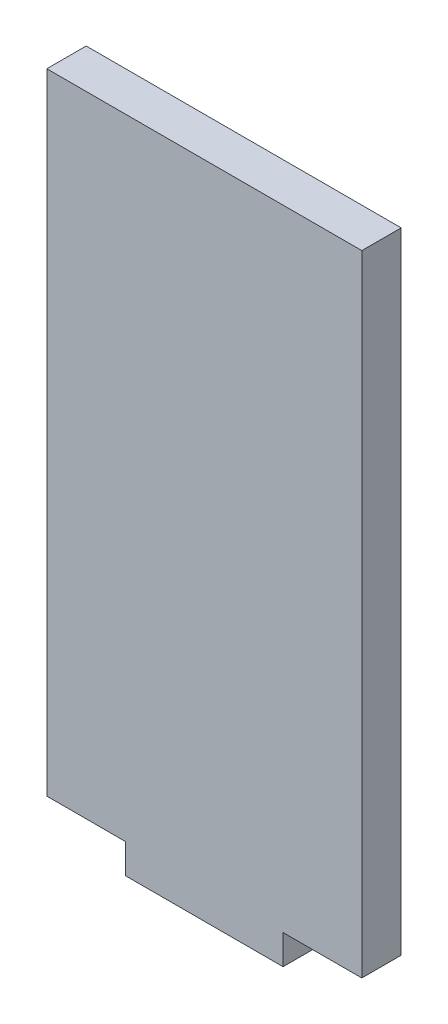
ISO-10303-21;
HEADER;
FILE_DESCRIPTION(('STEP AP214'),'2;1');
FILE_NAME('part.step','',(''),(''),'','','');
FILE_SCHEMA(('AUTOMOTIVE_DESIGN { 1 0 10303 214 1 1 1 1 }'));
ENDSEC;
DATA;
#1=APPLICATION_CONTEXT('core data for automotive mechanical design processes');
#2=APPLICATION_PROTOCOL_DEFINITION('international standard','automotive_design',2000,#1);
#3=PRODUCT_CONTEXT('',#1,'mechanical');
#4=PRODUCT('Part','Part','',(#3));
#5=PRODUCT_RELATED_PRODUCT_CATEGORY('part','',(#4));
#6=PRODUCT_DEFINITION_FORMATION('','',#4);
#7=PRODUCT_DEFINITION_CONTEXT('part definition',#1,'design');
#8=PRODUCT_DEFINITION('design','',#6,#7);
#9=PRODUCT_DEFINITION_SHAPE('','',#8);
#10=(LENGTH_UNIT() NAMED_UNIT(*) SI_UNIT(.MILLI.,.METRE.));
#11=(NAMED_UNIT(*) PLANE_ANGLE_UNIT() SI_UNIT($,.RADIAN.));
#12=(NAMED_UNIT(*) SI_UNIT($,.STERADIAN.) SOLID_ANGLE_UNIT());
#13=UNCERTAINTY_MEASURE_WITH_UNIT(LENGTH_MEASURE(1.E-05),#10,'distance_accuracy_value','');
#14=(GEOMETRIC_REPRESENTATION_CONTEXT(3) GLOBAL_UNCERTAINTY_ASSIGNED_CONTEXT((#13)) GLOBAL_UNIT_ASSIGNED_CONTEXT((#10,
#11,#12)) REPRESENTATION_CONTEXT('',''));
#15=CARTESIAN_POINT('',(0.,0.,0.));
#16=DIRECTION('',(0.,0.,1.));
#17=DIRECTION('',(1.,0.,0.));
#18=AXIS2_PLACEMENT_3D('',#15,#16,#17);
#19=CARTESIAN_POINT('',(0.,0.,3.175));
#20=DIRECTION('',(1.,0.,0.));
#21=DIRECTION('',(0.,1.,0.));
#22=AXIS2_PLACEMENT_3D('',#19,#20,#21);
#23=PLANE('',#22);
#24=DIRECTION('',(0.,-1.,0.));
#25=VECTOR('',#24,1.);
#26=CARTESIAN_POINT('',(0.,0.,0.));
#27=LINE('',#26,#25);
#28=CARTESIAN_POINT('',(0.,50.8,0.));
#29=VERTEX_POINT('',#28);
#30=CARTESIAN_POINT('',(0.,0.,0.));
#31=VERTEX_POINT('',#30);
#32=EDGE_CURVE('E129',#29,#31,#27,.T.);
#33=ORIENTED_EDGE('',*,*,#32,.T.);
#34=DIRECTION('',(0.,0.,-1.));
#35=VECTOR('',#34,1.);
#36=CARTESIAN_POINT('',(0.,0.,3.175));
#37=LINE('',#36,#35);
#38=CARTESIAN_POINT('',(0.,0.,3.175));
#39=VERTEX_POINT('',#38);
#40=EDGE_CURVE('E11',#39,#31,#37,.T.);
#41=ORIENTED_EDGE('',*,*,#40,.F.);
#42=DIRECTION('',(0.,-1.,0.));
#43=VECTOR('',#42,1.);
#44=CARTESIAN_POINT('',(0.,0.,3.175));
#45=LINE('',#44,#43);
#46=CARTESIAN_POINT('',(0.,50.8,3.175));
#47=VERTEX_POINT('',#46);
#48=EDGE_CURVE('E143',#47,#39,#45,.T.);
#49=ORIENTED_EDGE('',*,*,#48,.F.);
#50=DIRECTION('',(0.,0.,-1.));
#51=VECTOR('',#50,1.);
#52=CARTESIAN_POINT('',(0.,50.8,3.175));
#53=LINE('',#52,#51);
#54=EDGE_CURVE('E125',#47,#29,#53,.T.);
#55=ORIENTED_EDGE('',*,*,#54,.T.);
#56=EDGE_LOOP('',(#33,#41,#49,#55));
#57=FACE_BOUND('',#56,.T.);
#58=ADVANCED_FACE('F33',(#57),#23,.F.);
#59=CARTESIAN_POINT('',(0.,0.,3.175));
#60=DIRECTION('',(0.,1.,0.));
#61=DIRECTION('',(0.,0.,1.));
#62=AXIS2_PLACEMENT_3D('',#59,#60,#61);
#63=PLANE('',#62);
#64=DIRECTION('',(1.,0.,0.));
#65=VECTOR('',#64,1.);
#66=CARTESIAN_POINT('',(0.,0.,0.));
#67=LINE('',#66,#65);
#68=CARTESIAN_POINT('',(6.35,0.,0.));
#69=VERTEX_POINT('',#68);
#70=EDGE_CURVE('E132',#31,#69,#67,.T.);
#71=ORIENTED_EDGE('',*,*,#70,.T.);
#72=DIRECTION('',(0.,0.,-1.));
#73=VECTOR('',#72,1.);
#74=CARTESIAN_POINT('',(6.35,0.,3.175));
#75=LINE('',#74,#73);
#76=CARTESIAN_POINT('',(6.35,0.,3.175));
#77=VERTEX_POINT('',#76);
#78=EDGE_CURVE('E41',#77,#69,#75,.T.);
#79=ORIENTED_EDGE('',*,*,#78,.F.);
#80=DIRECTION('',(1.,0.,0.));
#81=VECTOR('',#80,1.);
#82=CARTESIAN_POINT('',(0.,0.,3.175));
#83=LINE('',#82,#81);
#84=EDGE_CURVE('E92',#39,#77,#83,.T.);
#85=ORIENTED_EDGE('',*,*,#84,.F.);
#86=ORIENTED_EDGE('',*,*,#40,.T.);
#87=EDGE_LOOP('',(#71,#79,#85,#86));
#88=FACE_BOUND('',#87,.T.);
#89=ADVANCED_FACE('F178',(#88),#63,.F.);
#90=CARTESIAN_POINT('',(6.35,0.,3.175));
#91=DIRECTION('',(1.,0.,0.));
#92=DIRECTION('',(0.,0.,-1.));
#93=AXIS2_PLACEMENT_3D('',#90,#91,#92);
#94=PLANE('',#93);
#95=DIRECTION('',(0.,-1.,0.));
#96=VECTOR('',#95,1.);
#97=CARTESIAN_POINT('',(6.35,0.,0.));
#98=LINE('',#97,#96);
#99=CARTESIAN_POINT('',(6.35,-2.38793491823931,0.));
#100=VERTEX_POINT('',#99);
#101=EDGE_CURVE('E134',#69,#100,#98,.T.);
#102=ORIENTED_EDGE('',*,*,#101,.T.);
#103=DIRECTION('',(0.,0.,-1.));
#104=VECTOR('',#103,1.);
#105=CARTESIAN_POINT('',(6.35,-2.38793491823931,3.175));
#106=LINE('',#105,#104);
#107=CARTESIAN_POINT('',(6.35,-2.38793491823931,3.175));
#108=VERTEX_POINT('',#107);
#109=EDGE_CURVE('E150',#108,#100,#106,.T.);
#110=ORIENTED_EDGE('',*,*,#109,.F.);
#111=DIRECTION('',(0.,-1.,0.));
#112=VECTOR('',#111,1.);
#113=CARTESIAN_POINT('',(6.35,0.,3.175));
#114=LINE('',#113,#112);
#115=EDGE_CURVE('E158',#77,#108,#114,.T.);
#116=ORIENTED_EDGE('',*,*,#115,.F.);
#117=ORIENTED_EDGE('',*,*,#78,.T.);
#118=EDGE_LOOP('',(#102,#110,#116,#117));
#119=FACE_BOUND('',#118,.T.);
#120=ADVANCED_FACE('F156',(#119),#94,.F.);
#121=CARTESIAN_POINT('',(6.35,-2.38793491823931,3.175));
#122=DIRECTION('',(0.,1.,0.));
#123=DIRECTION('',(0.,0.,1.));
#124=AXIS2_PLACEMENT_3D('',#121,#122,#123);
#125=PLANE('',#124);
#126=DIRECTION('',(1.,0.,0.));
#127=VECTOR('',#126,1.);
#128=CARTESIAN_POINT('',(6.35,-2.38793491823931,0.));
#129=LINE('',#128,#127);
#130=CARTESIAN_POINT('',(19.05,-2.38793491823931,0.));
#131=VERTEX_POINT('',#130);
#132=EDGE_CURVE('E136',#100,#131,#129,.T.);
#133=ORIENTED_EDGE('',*,*,#132,.T.);
#134=DIRECTION('',(0.,0.,-1.));
#135=VECTOR('',#134,1.);
#136=CARTESIAN_POINT('',(19.05,-2.38793491823931,3.175));
#137=LINE('',#136,#135);
#138=CARTESIAN_POINT('',(19.05,-2.38793491823931,3.175));
#139=VERTEX_POINT('',#138);
#140=EDGE_CURVE('E147',#139,#131,#137,.T.);
#141=ORIENTED_EDGE('',*,*,#140,.F.);
#142=DIRECTION('',(1.,0.,0.));
#143=VECTOR('',#142,1.);
#144=CARTESIAN_POINT('',(6.35,-2.38793491823931,3.175));
#145=LINE('',#144,#143);
#146=EDGE_CURVE('E170',#108,#139,#145,.T.);
#147=ORIENTED_EDGE('',*,*,#146,.F.);
#148=ORIENTED_EDGE('',*,*,#109,.T.);
#149=EDGE_LOOP('',(#133,#141,#147,#148));
#150=FACE_BOUND('',#149,.T.);
#151=ADVANCED_FACE('F166',(#150),#125,.F.);
#152=CARTESIAN_POINT('',(19.05,-2.38793491823931,3.175));
#153=DIRECTION('',(-1.,0.,0.));
#154=DIRECTION('',(0.,0.,1.));
#155=AXIS2_PLACEMENT_3D('',#152,#153,#154);
#156=PLANE('',#155);
#157=DIRECTION('',(0.,1.,0.));
#158=VECTOR('',#157,1.);
#159=CARTESIAN_POINT('',(19.05,-2.38793491823931,0.));
#160=LINE('',#159,#158);
#161=CARTESIAN_POINT('',(19.05,0.,0.));
#162=VERTEX_POINT('',#161);
#163=EDGE_CURVE('E138',#131,#162,#160,.T.);
#164=ORIENTED_EDGE('',*,*,#163,.T.);
#165=DIRECTION('',(0.,0.,-1.));
#166=VECTOR('',#165,1.);
#167=CARTESIAN_POINT('',(19.05,0.,3.175));
#168=LINE('',#167,#166);
#169=CARTESIAN_POINT('',(19.05,0.,3.175));
#170=VERTEX_POINT('',#169);
#171=EDGE_CURVE('E120',#170,#162,#168,.T.);
#172=ORIENTED_EDGE('',*,*,#171,.F.);
#173=DIRECTION('',(0.,1.,0.));
#174=VECTOR('',#173,1.);
#175=CARTESIAN_POINT('',(19.05,-2.38793491823931,3.175));
#176=LINE('',#175,#174);
#177=EDGE_CURVE('E111',#139,#170,#176,.T.);
#178=ORIENTED_EDGE('',*,*,#177,.F.);
#179=ORIENTED_EDGE('',*,*,#140,.T.);
#180=EDGE_LOOP('',(#164,#172,#178,#179));
#181=FACE_BOUND('',#180,.T.);
#182=ADVANCED_FACE('F169',(#181),#156,.F.);
#183=CARTESIAN_POINT('',(19.05,0.,3.175));
#184=DIRECTION('',(0.,1.,0.));
#185=DIRECTION('',(0.,0.,1.));
#186=AXIS2_PLACEMENT_3D('',#183,#184,#185);
#187=PLANE('',#186);
#188=DIRECTION('',(1.,0.,0.));
#189=VECTOR('',#188,1.);
#190=CARTESIAN_POINT('',(19.05,0.,0.));
#191=LINE('',#190,#189);
#192=CARTESIAN_POINT('',(25.4,0.,0.));
#193=VERTEX_POINT('',#192);
#194=EDGE_CURVE('E119',#162,#193,#191,.T.);
#195=ORIENTED_EDGE('',*,*,#194,.T.);
#196=DIRECTION('',(0.,0.,-1.));
#197=VECTOR('',#196,1.);
#198=CARTESIAN_POINT('',(25.4,0.,3.175));
#199=LINE('',#198,#197);
#200=CARTESIAN_POINT('',(25.4,0.,3.175));
#201=VERTEX_POINT('',#200);
#202=EDGE_CURVE('E116',#201,#193,#199,.T.);
#203=ORIENTED_EDGE('',*,*,#202,.F.);
#204=DIRECTION('',(1.,0.,0.));
#205=VECTOR('',#204,1.);
#206=CARTESIAN_POINT('',(19.05,0.,3.175));
#207=LINE('',#206,#205);
#208=EDGE_CURVE('E105',#170,#201,#207,.T.);
#209=ORIENTED_EDGE('',*,*,#208,.F.);
#210=ORIENTED_EDGE('',*,*,#171,.T.);
#211=EDGE_LOOP('',(#195,#203,#209,#210));
#212=FACE_BOUND('',#211,.T.);
#213=ADVANCED_FACE('F117',(#212),#187,.F.);
#214=CARTESIAN_POINT('',(25.4,0.,3.175));
#215=DIRECTION('',(-1.,0.,0.));
#216=DIRECTION('',(0.,-1.,0.));
#217=AXIS2_PLACEMENT_3D('',#214,#215,#216);
#218=PLANE('',#217);
#219=DIRECTION('',(0.,1.,0.));
#220=VECTOR('',#219,1.);
#221=CARTESIAN_POINT('',(25.4,0.,0.));
#222=LINE('',#221,#220);
#223=CARTESIAN_POINT('',(25.4,50.8,0.));
#224=VERTEX_POINT('',#223);
#225=EDGE_CURVE('E78',#193,#224,#222,.T.);
#226=ORIENTED_EDGE('',*,*,#225,.T.);
#227=DIRECTION('',(0.,0.,-1.));
#228=VECTOR('',#227,1.);
#229=CARTESIAN_POINT('',(25.4,50.8,3.175));
#230=LINE('',#229,#228);
#231=CARTESIAN_POINT('',(25.4,50.8,3.175));
#232=VERTEX_POINT('',#231);
#233=EDGE_CURVE('E121',#232,#224,#230,.T.);
#234=ORIENTED_EDGE('',*,*,#233,.F.);
#235=DIRECTION('',(0.,1.,0.));
#236=VECTOR('',#235,1.);
#237=CARTESIAN_POINT('',(25.4,0.,3.175));
#238=LINE('',#237,#236);
#239=EDGE_CURVE('E109',#201,#232,#238,.T.);
#240=ORIENTED_EDGE('',*,*,#239,.F.);
#241=ORIENTED_EDGE('',*,*,#202,.T.);
#242=EDGE_LOOP('',(#226,#234,#240,#241));
#243=FACE_BOUND('',#242,.T.);
#244=ADVANCED_FACE('F123',(#243),#218,.F.);
#245=CARTESIAN_POINT('',(0.,50.8,3.175));
#246=DIRECTION('',(0.,-1.,0.));
#247=DIRECTION('',(0.,0.,-1.));
#248=AXIS2_PLACEMENT_3D('',#245,#246,#247);
#249=PLANE('',#248);
#250=DIRECTION('',(-1.,0.,0.));
#251=VECTOR('',#250,1.);
#252=CARTESIAN_POINT('',(0.,50.8,0.));
#253=LINE('',#252,#251);
#254=EDGE_CURVE('E84',#224,#29,#253,.T.);
#255=ORIENTED_EDGE('',*,*,#254,.T.);
#256=ORIENTED_EDGE('',*,*,#54,.F.);
#257=DIRECTION('',(-1.,0.,0.));
#258=VECTOR('',#257,1.);
#259=CARTESIAN_POINT('',(0.,50.8,3.175));
#260=LINE('',#259,#258);
#261=EDGE_CURVE('E49',#232,#47,#260,.T.);
#262=ORIENTED_EDGE('',*,*,#261,.F.);
#263=ORIENTED_EDGE('',*,*,#233,.T.);
#264=EDGE_LOOP('',(#255,#256,#262,#263));
#265=FACE_BOUND('',#264,.T.);
#266=ADVANCED_FACE('F194',(#265),#249,.F.);
#267=CARTESIAN_POINT('',(0.,0.,3.175));
#268=DIRECTION('',(0.,0.,-1.));
#269=DIRECTION('',(-1.,0.,0.));
#270=AXIS2_PLACEMENT_3D('',#267,#268,#269);
#271=PLANE('',#270);
#272=ORIENTED_EDGE('',*,*,#48,.T.);
#273=ORIENTED_EDGE('',*,*,#84,.T.);
#274=ORIENTED_EDGE('',*,*,#115,.T.);
#275=ORIENTED_EDGE('',*,*,#146,.T.);
#276=ORIENTED_EDGE('',*,*,#177,.T.);
#277=ORIENTED_EDGE('',*,*,#208,.T.);
#278=ORIENTED_EDGE('',*,*,#239,.T.);
#279=ORIENTED_EDGE('',*,*,#261,.T.);
#280=EDGE_LOOP('',(#272,#273,#274,#275,#276,#277,#278,#279));
#281=FACE_BOUND('',#280,.T.);
#282=ADVANCED_FACE('F107',(#281),#271,.F.);
#283=CARTESIAN_POINT('',(0.,0.,0.));
#284=DIRECTION('',(0.,0.,-1.));
#285=DIRECTION('',(-1.,0.,0.));
#286=AXIS2_PLACEMENT_3D('',#283,#284,#285);
#287=PLANE('',#286);
#288=ORIENTED_EDGE('',*,*,#32,.F.);
#289=ORIENTED_EDGE('',*,*,#254,.F.);
#290=ORIENTED_EDGE('',*,*,#225,.F.);
#291=ORIENTED_EDGE('',*,*,#194,.F.);
#292=ORIENTED_EDGE('',*,*,#163,.F.);
#293=ORIENTED_EDGE('',*,*,#132,.F.);
#294=ORIENTED_EDGE('',*,*,#101,.F.);
#295=ORIENTED_EDGE('',*,*,#70,.F.);
#296=EDGE_LOOP('',(#288,#289,#290,#291,#292,#293,#294,#295));
#297=FACE_BOUND('',#296,.T.);
#298=ADVANCED_FACE('F162',(#297),#287,.T.);
#299=CLOSED_SHELL('',(#58,#89,#120,#151,#182,#213,#244,#266,#282,#298));
#300=MANIFOLD_SOLID_BREP('B2',#299);
#301=ADVANCED_BREP_SHAPE_REPRESENTATION('',(#18,#300),#14);
#302=SHAPE_DEFINITION_REPRESENTATION(#9,#301);
ENDSEC;
END-ISO-10303-21;
